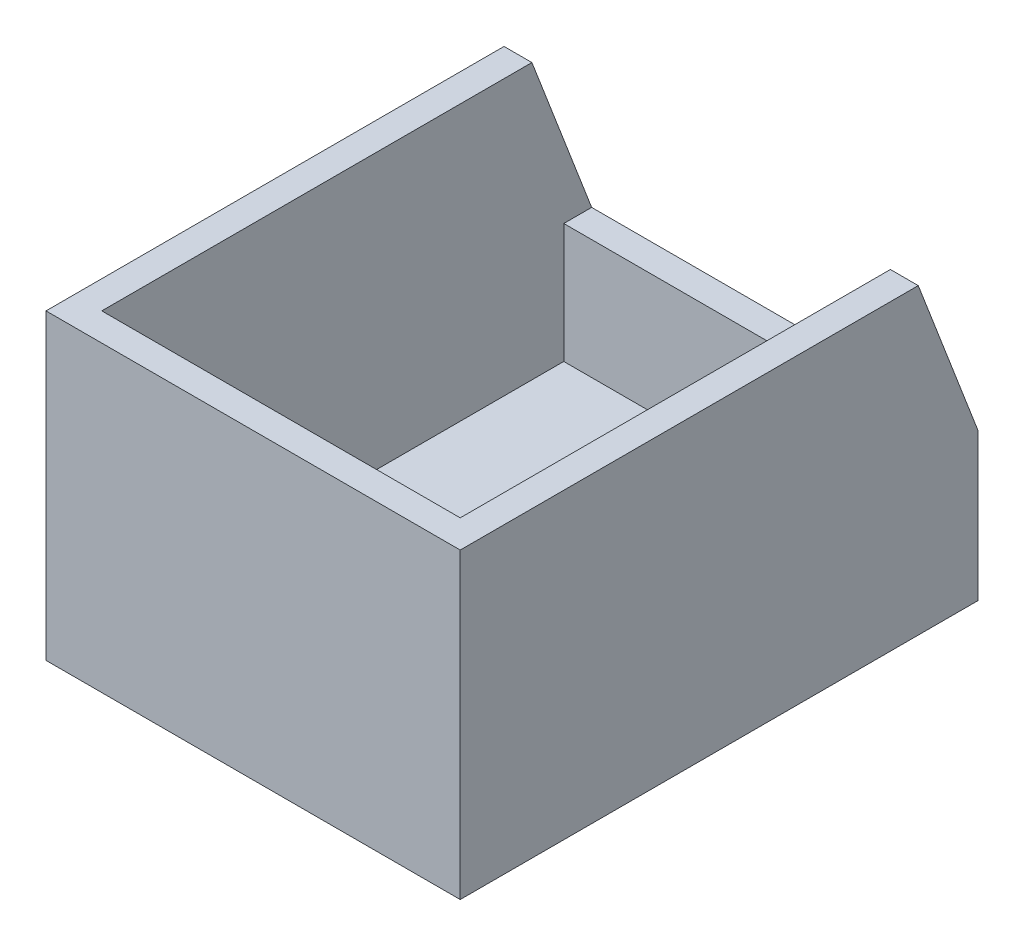
ISO-10303-21;
HEADER;
FILE_DESCRIPTION(('STEP AP214'),'2;1');
FILE_NAME('part.step','',(''),(''),'','','');
FILE_SCHEMA(('AUTOMOTIVE_DESIGN { 1 0 10303 214 1 1 1 1 }'));
ENDSEC;
DATA;
#1=APPLICATION_CONTEXT('core data for automotive mechanical design processes');
#2=APPLICATION_PROTOCOL_DEFINITION('international standard','automotive_design',2000,#1);
#3=PRODUCT_CONTEXT('',#1,'mechanical');
#4=PRODUCT('Part','Part','',(#3));
#5=PRODUCT_RELATED_PRODUCT_CATEGORY('part','',(#4));
#6=PRODUCT_DEFINITION_FORMATION('','',#4);
#7=PRODUCT_DEFINITION_CONTEXT('part definition',#1,'design');
#8=PRODUCT_DEFINITION('design','',#6,#7);
#9=PRODUCT_DEFINITION_SHAPE('','',#8);
#10=(LENGTH_UNIT() NAMED_UNIT(*) SI_UNIT(.MILLI.,.METRE.));
#11=(NAMED_UNIT(*) PLANE_ANGLE_UNIT() SI_UNIT($,.RADIAN.));
#12=(NAMED_UNIT(*) SI_UNIT($,.STERADIAN.) SOLID_ANGLE_UNIT());
#13=UNCERTAINTY_MEASURE_WITH_UNIT(LENGTH_MEASURE(1.E-05),#10,'distance_accuracy_value','');
#14=(GEOMETRIC_REPRESENTATION_CONTEXT(3) GLOBAL_UNCERTAINTY_ASSIGNED_CONTEXT((#13)) GLOBAL_UNIT_ASSIGNED_CONTEXT((#10,
#11,#12)) REPRESENTATION_CONTEXT('',''));
#15=CARTESIAN_POINT('',(0.,0.,0.));
#16=DIRECTION('',(0.,0.,1.));
#17=DIRECTION('',(1.,0.,0.));
#18=AXIS2_PLACEMENT_3D('',#15,#16,#17);
#19=CARTESIAN_POINT('',(104.,37.,-130.));
#20=DIRECTION('',(0.,-0.358979079308869,0.93334560620306));
#21=DIRECTION('',(0.,-0.93334560620306,-0.358979079308869));
#22=AXIS2_PLACEMENT_3D('',#19,#20,#21);
#23=PLANE('',#22);
#24=DIRECTION('',(0.,0.93334560620306,0.358979079308869));
#25=VECTOR('',#24,1.);
#26=CARTESIAN_POINT('',(7.00000000000001,37.,-130.));
#27=LINE('',#26,#25);
#28=CARTESIAN_POINT('',(7.,37.,-130.));
#29=VERTEX_POINT('',#28);
#30=CARTESIAN_POINT('',(7.00000000000001,76.,-115.));
#31=VERTEX_POINT('',#30);
#32=EDGE_CURVE('E160',#29,#31,#27,.T.);
#33=ORIENTED_EDGE('',*,*,#32,.F.);
#34=DIRECTION('',(-1.,0.,0.));
#35=VECTOR('',#34,1.);
#36=CARTESIAN_POINT('',(104.,37.,-130.));
#37=LINE('',#36,#35);
#38=CARTESIAN_POINT('',(0.,37.,-130.));
#39=VERTEX_POINT('',#38);
#40=EDGE_CURVE('E124',#29,#39,#37,.T.);
#41=ORIENTED_EDGE('',*,*,#40,.T.);
#42=DIRECTION('',(0.,0.93334560620306,0.358979079308869));
#43=VECTOR('',#42,1.);
#44=CARTESIAN_POINT('',(0.,37.,-130.));
#45=LINE('',#44,#43);
#46=CARTESIAN_POINT('',(0.,76.,-115.));
#47=VERTEX_POINT('',#46);
#48=EDGE_CURVE('E142',#39,#47,#45,.T.);
#49=ORIENTED_EDGE('',*,*,#48,.T.);
#50=DIRECTION('',(-1.,0.,0.));
#51=VECTOR('',#50,1.);
#52=CARTESIAN_POINT('',(104.,76.,-115.));
#53=LINE('',#52,#51);
#54=EDGE_CURVE('E148',#31,#47,#53,.T.);
#55=ORIENTED_EDGE('',*,*,#54,.F.);
#56=EDGE_LOOP('',(#33,#41,#49,#55));
#57=FACE_BOUND('',#56,.T.);
#58=ADVANCED_FACE('F42',(#57),#23,.F.);
#59=CARTESIAN_POINT('',(104.,37.,-130.));
#60=VERTEX_POINT('',#59);
#61=CARTESIAN_POINT('',(97.,37.,-130.));
#62=VERTEX_POINT('',#61);
#63=EDGE_CURVE('E115',#60,#62,#37,.T.);
#64=ORIENTED_EDGE('',*,*,#63,.T.);
#65=DIRECTION('',(0.,0.93334560620306,0.358979079308869));
#66=VECTOR('',#65,1.);
#67=CARTESIAN_POINT('',(97.,37.,-130.));
#68=LINE('',#67,#66);
#69=CARTESIAN_POINT('',(97.,76.,-115.));
#70=VERTEX_POINT('',#69);
#71=EDGE_CURVE('E206',#62,#70,#68,.T.);
#72=ORIENTED_EDGE('',*,*,#71,.T.);
#73=CARTESIAN_POINT('',(104.,76.,-115.));
#74=VERTEX_POINT('',#73);
#75=EDGE_CURVE('E128',#74,#70,#53,.T.);
#76=ORIENTED_EDGE('',*,*,#75,.F.);
#77=DIRECTION('',(0.,0.93334560620306,0.358979079308869));
#78=VECTOR('',#77,1.);
#79=CARTESIAN_POINT('',(104.,37.,-130.));
#80=LINE('',#79,#78);
#81=EDGE_CURVE('E108',#60,#74,#80,.T.);
#82=ORIENTED_EDGE('',*,*,#81,.F.);
#83=EDGE_LOOP('',(#64,#72,#76,#82));
#84=FACE_BOUND('',#83,.T.);
#85=ADVANCED_FACE('F126',(#84),#23,.F.);
#86=CARTESIAN_POINT('',(104.,76.,-115.));
#87=DIRECTION('',(0.,-1.,0.));
#88=DIRECTION('',(0.,0.,-1.));
#89=AXIS2_PLACEMENT_3D('',#86,#87,#88);
#90=PLANE('',#89);
#91=DIRECTION('',(0.,0.,1.));
#92=VECTOR('',#91,1.);
#93=CARTESIAN_POINT('',(7.00000000000001,76.,-115.));
#94=LINE('',#93,#92);
#95=CARTESIAN_POINT('',(7.,76.,-7.));
#96=VERTEX_POINT('',#95);
#97=EDGE_CURVE('E186',#31,#96,#94,.T.);
#98=ORIENTED_EDGE('',*,*,#97,.F.);
#99=ORIENTED_EDGE('',*,*,#54,.T.);
#100=DIRECTION('',(0.,0.,1.));
#101=VECTOR('',#100,1.);
#102=CARTESIAN_POINT('',(0.,76.,-115.));
#103=LINE('',#102,#101);
#104=CARTESIAN_POINT('',(0.,76.,0.));
#105=VERTEX_POINT('',#104);
#106=EDGE_CURVE('E89',#47,#105,#103,.T.);
#107=ORIENTED_EDGE('',*,*,#106,.T.);
#108=DIRECTION('',(-1.,0.,0.));
#109=VECTOR('',#108,1.);
#110=CARTESIAN_POINT('',(104.,76.,0.));
#111=LINE('',#110,#109);
#112=CARTESIAN_POINT('',(104.,76.,0.));
#113=VERTEX_POINT('',#112);
#114=EDGE_CURVE('E130',#113,#105,#111,.T.);
#115=ORIENTED_EDGE('',*,*,#114,.F.);
#116=DIRECTION('',(0.,0.,1.));
#117=VECTOR('',#116,1.);
#118=CARTESIAN_POINT('',(104.,76.,-115.));
#119=LINE('',#118,#117);
#120=EDGE_CURVE('E66',#74,#113,#119,.T.);
#121=ORIENTED_EDGE('',*,*,#120,.F.);
#122=ORIENTED_EDGE('',*,*,#75,.T.);
#123=DIRECTION('',(0.,0.,1.));
#124=VECTOR('',#123,1.);
#125=CARTESIAN_POINT('',(97.,76.,-115.));
#126=LINE('',#125,#124);
#127=CARTESIAN_POINT('',(97.,76.,-7.));
#128=VERTEX_POINT('',#127);
#129=EDGE_CURVE('E201',#70,#128,#126,.T.);
#130=ORIENTED_EDGE('',*,*,#129,.T.);
#131=DIRECTION('',(-1.,0.,0.));
#132=VECTOR('',#131,1.);
#133=CARTESIAN_POINT('',(104.,76.,-7.));
#134=LINE('',#133,#132);
#135=EDGE_CURVE('E195',#128,#96,#134,.T.);
#136=ORIENTED_EDGE('',*,*,#135,.T.);
#137=EDGE_LOOP('',(#98,#99,#107,#115,#121,#122,#130,#136));
#138=FACE_BOUND('',#137,.T.);
#139=ADVANCED_FACE('F200',(#138),#90,.F.);
#140=CARTESIAN_POINT('',(104.,76.,0.));
#141=DIRECTION('',(0.,0.,-1.));
#142=DIRECTION('',(0.,1.,0.));
#143=AXIS2_PLACEMENT_3D('',#140,#141,#142);
#144=PLANE('',#143);
#145=DIRECTION('',(0.,-1.,0.));
#146=VECTOR('',#145,1.);
#147=CARTESIAN_POINT('',(0.,76.,0.));
#148=LINE('',#147,#146);
#149=CARTESIAN_POINT('',(0.,0.,0.));
#150=VERTEX_POINT('',#149);
#151=EDGE_CURVE('E134',#105,#150,#148,.T.);
#152=ORIENTED_EDGE('',*,*,#151,.T.);
#153=DIRECTION('',(-1.,0.,0.));
#154=VECTOR('',#153,1.);
#155=CARTESIAN_POINT('',(104.,0.,0.));
#156=LINE('',#155,#154);
#157=CARTESIAN_POINT('',(104.,0.,0.));
#158=VERTEX_POINT('',#157);
#159=EDGE_CURVE('E11',#158,#150,#156,.T.);
#160=ORIENTED_EDGE('',*,*,#159,.F.);
#161=DIRECTION('',(0.,-1.,0.));
#162=VECTOR('',#161,1.);
#163=CARTESIAN_POINT('',(104.,76.,0.));
#164=LINE('',#163,#162);
#165=EDGE_CURVE('E146',#113,#158,#164,.T.);
#166=ORIENTED_EDGE('',*,*,#165,.F.);
#167=ORIENTED_EDGE('',*,*,#114,.T.);
#168=EDGE_LOOP('',(#152,#160,#166,#167));
#169=FACE_BOUND('',#168,.T.);
#170=ADVANCED_FACE('F44',(#169),#144,.F.);
#171=CARTESIAN_POINT('',(104.,0.,0.));
#172=DIRECTION('',(0.,1.,0.));
#173=DIRECTION('',(0.,0.,1.));
#174=AXIS2_PLACEMENT_3D('',#171,#172,#173);
#175=PLANE('',#174);
#176=DIRECTION('',(0.,0.,-1.));
#177=VECTOR('',#176,1.);
#178=CARTESIAN_POINT('',(0.,0.,0.));
#179=LINE('',#178,#177);
#180=CARTESIAN_POINT('',(0.,0.,-130.));
#181=VERTEX_POINT('',#180);
#182=EDGE_CURVE('E137',#150,#181,#179,.T.);
#183=ORIENTED_EDGE('',*,*,#182,.T.);
#184=DIRECTION('',(-1.,0.,0.));
#185=VECTOR('',#184,1.);
#186=CARTESIAN_POINT('',(104.,0.,-130.));
#187=LINE('',#186,#185);
#188=CARTESIAN_POINT('',(104.,0.,-130.));
#189=VERTEX_POINT('',#188);
#190=EDGE_CURVE('E50',#189,#181,#187,.T.);
#191=ORIENTED_EDGE('',*,*,#190,.F.);
#192=DIRECTION('',(0.,0.,-1.));
#193=VECTOR('',#192,1.);
#194=CARTESIAN_POINT('',(104.,0.,0.));
#195=LINE('',#194,#193);
#196=EDGE_CURVE('E97',#158,#189,#195,.T.);
#197=ORIENTED_EDGE('',*,*,#196,.F.);
#198=ORIENTED_EDGE('',*,*,#159,.T.);
#199=EDGE_LOOP('',(#183,#191,#197,#198));
#200=FACE_BOUND('',#199,.T.);
#201=ADVANCED_FACE('F218',(#200),#175,.F.);
#202=CARTESIAN_POINT('',(104.,0.,-130.));
#203=DIRECTION('',(0.,0.,1.));
#204=DIRECTION('',(1.,0.,0.));
#205=AXIS2_PLACEMENT_3D('',#202,#203,#204);
#206=PLANE('',#205);
#207=DIRECTION('',(0.,1.,0.));
#208=VECTOR('',#207,1.);
#209=CARTESIAN_POINT('',(0.,0.,-130.));
#210=LINE('',#209,#208);
#211=EDGE_CURVE('E140',#181,#39,#210,.T.);
#212=ORIENTED_EDGE('',*,*,#211,.T.);
#213=ORIENTED_EDGE('',*,*,#40,.F.);
#214=DIRECTION('',(1.,0.,0.));
#215=VECTOR('',#214,1.);
#216=CARTESIAN_POINT('',(104.,37.,-130.));
#217=LINE('',#216,#215);
#218=EDGE_CURVE('E121',#29,#62,#217,.T.);
#219=ORIENTED_EDGE('',*,*,#218,.T.);
#220=ORIENTED_EDGE('',*,*,#63,.F.);
#221=DIRECTION('',(0.,1.,0.));
#222=VECTOR('',#221,1.);
#223=CARTESIAN_POINT('',(104.,0.,-130.));
#224=LINE('',#223,#222);
#225=EDGE_CURVE('E104',#189,#60,#224,.T.);
#226=ORIENTED_EDGE('',*,*,#225,.F.);
#227=ORIENTED_EDGE('',*,*,#190,.T.);
#228=EDGE_LOOP('',(#212,#213,#219,#220,#226,#227));
#229=FACE_BOUND('',#228,.T.);
#230=ADVANCED_FACE('F117',(#229),#206,.F.);
#231=CARTESIAN_POINT('',(104.,0.,0.));
#232=DIRECTION('',(1.,0.,0.));
#233=DIRECTION('',(0.,0.,-1.));
#234=AXIS2_PLACEMENT_3D('',#231,#232,#233);
#235=PLANE('',#234);
#236=ORIENTED_EDGE('',*,*,#165,.T.);
#237=ORIENTED_EDGE('',*,*,#196,.T.);
#238=ORIENTED_EDGE('',*,*,#225,.T.);
#239=ORIENTED_EDGE('',*,*,#81,.T.);
#240=ORIENTED_EDGE('',*,*,#120,.T.);
#241=EDGE_LOOP('',(#236,#237,#238,#239,#240));
#242=FACE_BOUND('',#241,.T.);
#243=ADVANCED_FACE('F106',(#242),#235,.T.);
#244=CARTESIAN_POINT('',(0.,0.,0.));
#245=DIRECTION('',(1.,0.,0.));
#246=DIRECTION('',(0.,0.,-1.));
#247=AXIS2_PLACEMENT_3D('',#244,#245,#246);
#248=PLANE('',#247);
#249=ORIENTED_EDGE('',*,*,#151,.F.);
#250=ORIENTED_EDGE('',*,*,#106,.F.);
#251=ORIENTED_EDGE('',*,*,#48,.F.);
#252=ORIENTED_EDGE('',*,*,#211,.F.);
#253=ORIENTED_EDGE('',*,*,#182,.F.);
#254=EDGE_LOOP('',(#249,#250,#251,#252,#253));
#255=FACE_BOUND('',#254,.T.);
#256=ADVANCED_FACE('F153',(#255),#248,.F.);
#257=CARTESIAN_POINT('',(104.,76.,-7.));
#258=DIRECTION('',(0.,0.,-1.));
#259=DIRECTION('',(0.,1.,0.));
#260=AXIS2_PLACEMENT_3D('',#257,#258,#259);
#261=PLANE('',#260);
#262=DIRECTION('',(0.,-1.,0.));
#263=VECTOR('',#262,1.);
#264=CARTESIAN_POINT('',(7.00000000000001,76.,-7.));
#265=LINE('',#264,#263);
#266=CARTESIAN_POINT('',(7.,7.,-7.));
#267=VERTEX_POINT('',#266);
#268=EDGE_CURVE('E189',#96,#267,#265,.T.);
#269=ORIENTED_EDGE('',*,*,#268,.F.);
#270=ORIENTED_EDGE('',*,*,#135,.F.);
#271=DIRECTION('',(0.,-1.,0.));
#272=VECTOR('',#271,1.);
#273=CARTESIAN_POINT('',(97.,76.,-7.));
#274=LINE('',#273,#272);
#275=CARTESIAN_POINT('',(97.,7.,-7.));
#276=VERTEX_POINT('',#275);
#277=EDGE_CURVE('E57',#128,#276,#274,.T.);
#278=ORIENTED_EDGE('',*,*,#277,.T.);
#279=DIRECTION('',(-1.,0.,0.));
#280=VECTOR('',#279,1.);
#281=CARTESIAN_POINT('',(104.,7.,-7.));
#282=LINE('',#281,#280);
#283=EDGE_CURVE('E138',#276,#267,#282,.T.);
#284=ORIENTED_EDGE('',*,*,#283,.T.);
#285=EDGE_LOOP('',(#269,#270,#278,#284));
#286=FACE_BOUND('',#285,.T.);
#287=ADVANCED_FACE('F194',(#286),#261,.T.);
#288=CARTESIAN_POINT('',(104.,7.,0.));
#289=DIRECTION('',(0.,1.,0.));
#290=DIRECTION('',(0.,0.,1.));
#291=AXIS2_PLACEMENT_3D('',#288,#289,#290);
#292=PLANE('',#291);
#293=DIRECTION('',(0.,0.,-1.));
#294=VECTOR('',#293,1.);
#295=CARTESIAN_POINT('',(7.00000000000001,7.,0.));
#296=LINE('',#295,#294);
#297=CARTESIAN_POINT('',(7.,7.,-123.));
#298=VERTEX_POINT('',#297);
#299=EDGE_CURVE('E198',#267,#298,#296,.T.);
#300=ORIENTED_EDGE('',*,*,#299,.F.);
#301=ORIENTED_EDGE('',*,*,#283,.F.);
#302=DIRECTION('',(0.,0.,-1.));
#303=VECTOR('',#302,1.);
#304=CARTESIAN_POINT('',(97.,7.,0.));
#305=LINE('',#304,#303);
#306=CARTESIAN_POINT('',(97.,7.,-123.));
#307=VERTEX_POINT('',#306);
#308=EDGE_CURVE('E273',#276,#307,#305,.T.);
#309=ORIENTED_EDGE('',*,*,#308,.T.);
#310=DIRECTION('',(-1.,0.,0.));
#311=VECTOR('',#310,1.);
#312=CARTESIAN_POINT('',(104.,7.,-123.));
#313=LINE('',#312,#311);
#314=EDGE_CURVE('E202',#307,#298,#313,.T.);
#315=ORIENTED_EDGE('',*,*,#314,.T.);
#316=EDGE_LOOP('',(#300,#301,#309,#315));
#317=FACE_BOUND('',#316,.T.);
#318=ADVANCED_FACE('F246',(#317),#292,.T.);
#319=CARTESIAN_POINT('',(104.,0.,-123.));
#320=DIRECTION('',(0.,0.,1.));
#321=DIRECTION('',(1.,0.,0.));
#322=AXIS2_PLACEMENT_3D('',#319,#320,#321);
#323=PLANE('',#322);
#324=DIRECTION('',(1.,0.,0.));
#325=VECTOR('',#324,1.);
#326=CARTESIAN_POINT('',(7.,37.,-123.));
#327=LINE('',#326,#325);
#328=CARTESIAN_POINT('',(7.,37.,-123.));
#329=VERTEX_POINT('',#328);
#330=CARTESIAN_POINT('',(97.,37.,-123.));
#331=VERTEX_POINT('',#330);
#332=EDGE_CURVE('E262',#329,#331,#327,.T.);
#333=ORIENTED_EDGE('',*,*,#332,.F.);
#334=DIRECTION('',(0.,1.,0.));
#335=VECTOR('',#334,1.);
#336=CARTESIAN_POINT('',(7.00000000000001,0.,-123.));
#337=LINE('',#336,#335);
#338=EDGE_CURVE('E213',#298,#329,#337,.T.);
#339=ORIENTED_EDGE('',*,*,#338,.F.);
#340=ORIENTED_EDGE('',*,*,#314,.F.);
#341=DIRECTION('',(0.,1.,0.));
#342=VECTOR('',#341,1.);
#343=CARTESIAN_POINT('',(97.,0.,-123.));
#344=LINE('',#343,#342);
#345=EDGE_CURVE('E209',#307,#331,#344,.T.);
#346=ORIENTED_EDGE('',*,*,#345,.T.);
#347=EDGE_LOOP('',(#333,#339,#340,#346));
#348=FACE_BOUND('',#347,.T.);
#349=ADVANCED_FACE('F243',(#348),#323,.T.);
#350=CARTESIAN_POINT('',(97.,0.,0.));
#351=DIRECTION('',(1.,0.,0.));
#352=DIRECTION('',(0.,0.,-1.));
#353=AXIS2_PLACEMENT_3D('',#350,#351,#352);
#354=PLANE('',#353);
#355=ORIENTED_EDGE('',*,*,#277,.F.);
#356=ORIENTED_EDGE('',*,*,#129,.F.);
#357=ORIENTED_EDGE('',*,*,#71,.F.);
#358=DIRECTION('',(0.,0.,1.));
#359=VECTOR('',#358,1.);
#360=CARTESIAN_POINT('',(97.,37.,-227.));
#361=LINE('',#360,#359);
#362=EDGE_CURVE('E265',#62,#331,#361,.T.);
#363=ORIENTED_EDGE('',*,*,#362,.T.);
#364=ORIENTED_EDGE('',*,*,#345,.F.);
#365=ORIENTED_EDGE('',*,*,#308,.F.);
#366=EDGE_LOOP('',(#355,#356,#357,#363,#364,#365));
#367=FACE_BOUND('',#366,.T.);
#368=ADVANCED_FACE('F240',(#367),#354,.F.);
#369=CARTESIAN_POINT('',(7.,0.,0.));
#370=DIRECTION('',(1.,0.,0.));
#371=DIRECTION('',(0.,0.,-1.));
#372=AXIS2_PLACEMENT_3D('',#369,#370,#371);
#373=PLANE('',#372);
#374=ORIENTED_EDGE('',*,*,#268,.T.);
#375=ORIENTED_EDGE('',*,*,#299,.T.);
#376=ORIENTED_EDGE('',*,*,#338,.T.);
#377=DIRECTION('',(0.,0.,1.));
#378=VECTOR('',#377,1.);
#379=CARTESIAN_POINT('',(7.,37.,-227.));
#380=LINE('',#379,#378);
#381=EDGE_CURVE('E259',#29,#329,#380,.T.);
#382=ORIENTED_EDGE('',*,*,#381,.F.);
#383=ORIENTED_EDGE('',*,*,#32,.T.);
#384=ORIENTED_EDGE('',*,*,#97,.T.);
#385=EDGE_LOOP('',(#374,#375,#376,#382,#383,#384));
#386=FACE_BOUND('',#385,.T.);
#387=ADVANCED_FACE('F188',(#386),#373,.T.);
#388=CARTESIAN_POINT('',(7.,37.,-227.));
#389=DIRECTION('',(0.,-1.,0.));
#390=DIRECTION('',(0.,0.,-1.));
#391=AXIS2_PLACEMENT_3D('',#388,#389,#390);
#392=PLANE('',#391);
#393=ORIENTED_EDGE('',*,*,#381,.T.);
#394=ORIENTED_EDGE('',*,*,#332,.T.);
#395=ORIENTED_EDGE('',*,*,#362,.F.);
#396=ORIENTED_EDGE('',*,*,#218,.F.);
#397=EDGE_LOOP('',(#393,#394,#395,#396));
#398=FACE_BOUND('',#397,.T.);
#399=ADVANCED_FACE('F239',(#398),#392,.F.);
#400=CLOSED_SHELL('',(#58,#85,#139,#170,#201,#230,#243,#256,#287,#318,#349,#368,#387,#399));
#401=MANIFOLD_SOLID_BREP('B2',#400);
#402=ADVANCED_BREP_SHAPE_REPRESENTATION('',(#18,#401),#14);
#403=SHAPE_DEFINITION_REPRESENTATION(#9,#402);
ENDSEC;
END-ISO-10303-21;
